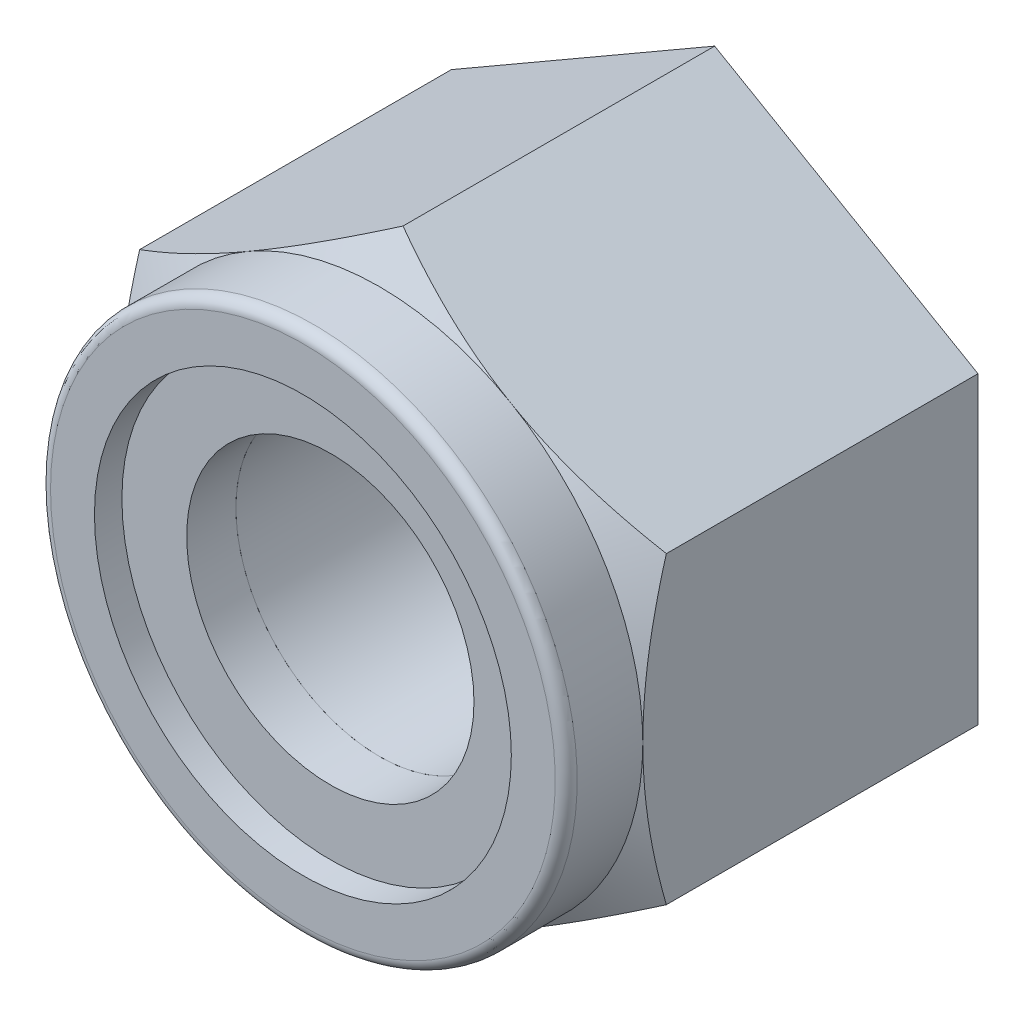
ISO-10303-21;
HEADER;
FILE_DESCRIPTION(('STEP AP214'),'2;1');
FILE_NAME('part.step','',(''),(''),'','','');
FILE_SCHEMA(('AUTOMOTIVE_DESIGN { 1 0 10303 214 1 1 1 1 }'));
ENDSEC;
DATA;
#1=APPLICATION_CONTEXT('core data for automotive mechanical design processes');
#2=APPLICATION_PROTOCOL_DEFINITION('international standard','automotive_design',2000,#1);
#3=PRODUCT_CONTEXT('',#1,'mechanical');
#4=PRODUCT('Part','Part','',(#3));
#5=PRODUCT_RELATED_PRODUCT_CATEGORY('part','',(#4));
#6=PRODUCT_DEFINITION_FORMATION('','',#4);
#7=PRODUCT_DEFINITION_CONTEXT('part definition',#1,'design');
#8=PRODUCT_DEFINITION('design','',#6,#7);
#9=PRODUCT_DEFINITION_SHAPE('','',#8);
#10=(LENGTH_UNIT() NAMED_UNIT(*) SI_UNIT(.MILLI.,.METRE.));
#11=(NAMED_UNIT(*) PLANE_ANGLE_UNIT() SI_UNIT($,.RADIAN.));
#12=(NAMED_UNIT(*) SI_UNIT($,.STERADIAN.) SOLID_ANGLE_UNIT());
#13=UNCERTAINTY_MEASURE_WITH_UNIT(LENGTH_MEASURE(1.E-05),#10,'distance_accuracy_value','');
#14=(GEOMETRIC_REPRESENTATION_CONTEXT(3) GLOBAL_UNCERTAINTY_ASSIGNED_CONTEXT((#13)) GLOBAL_UNIT_ASSIGNED_CONTEXT((#10,
#11,#12)) REPRESENTATION_CONTEXT('',''));
#15=CARTESIAN_POINT('',(0.,0.,0.));
#16=DIRECTION('',(0.,0.,1.));
#17=DIRECTION('',(1.,0.,0.));
#18=AXIS2_PLACEMENT_3D('',#15,#16,#17);
#19=CARTESIAN_POINT('',(0.,0.,10.9806921506248));
#20=DIRECTION('',(0.,0.,-1.));
#21=DIRECTION('',(-1.,0.,0.));
#22=AXIS2_PLACEMENT_3D('',#19,#20,#21);
#23=CYLINDRICAL_SURFACE('',#22,2.46333333333333);
#24=CARTESIAN_POINT('',(0.,0.,3.5));
#25=DIRECTION('',(0.,0.,1.));
#26=DIRECTION('',(1.,0.,0.));
#27=AXIS2_PLACEMENT_3D('',#24,#25,#26);
#28=CIRCLE('',#27,2.46333333333333);
#29=CARTESIAN_POINT('',(2.46333333333333,0.,3.5));
#30=VERTEX_POINT('',#29);
#31=EDGE_CURVE('E58',#30,#30,#28,.T.);
#32=ORIENTED_EDGE('',*,*,#31,.T.);
#33=EDGE_LOOP('',(#32));
#34=FACE_BOUND('',#33,.T.);
#35=CARTESIAN_POINT('',(0.,0.,4.01333333333333));
#36=DIRECTION('',(0.,0.,1.));
#37=DIRECTION('',(1.,0.,0.));
#38=AXIS2_PLACEMENT_3D('',#35,#36,#37);
#39=CIRCLE('',#38,2.46333333333333);
#40=CARTESIAN_POINT('',(2.46333333333333,0.,4.01333333333333));
#41=VERTEX_POINT('',#40);
#42=EDGE_CURVE('E11',#41,#41,#39,.T.);
#43=ORIENTED_EDGE('',*,*,#42,.F.);
#44=EDGE_LOOP('',(#43));
#45=FACE_BOUND('',#44,.T.);
#46=ADVANCED_FACE('F50',(#34,#45),#23,.T.);
#47=CARTESIAN_POINT('',(0.,0.,3.5));
#48=DIRECTION('',(0.,0.,1.));
#49=DIRECTION('',(1.,0.,0.));
#50=AXIS2_PLACEMENT_3D('',#47,#48,#49);
#51=PLANE('',#50);
#52=ORIENTED_EDGE('',*,*,#31,.F.);
#53=EDGE_LOOP('',(#52));
#54=FACE_BOUND('',#53,.T.);
#55=CARTESIAN_POINT('',(0.,0.,3.5));
#56=DIRECTION('',(0.,0.,1.));
#57=DIRECTION('',(1.,0.,0.));
#58=AXIS2_PLACEMENT_3D('',#55,#56,#57);
#59=CIRCLE('',#58,1.5);
#60=CARTESIAN_POINT('',(1.5,0.,3.5));
#61=VERTEX_POINT('',#60);
#62=EDGE_CURVE('E65',#61,#61,#59,.T.);
#63=ORIENTED_EDGE('',*,*,#62,.T.);
#64=EDGE_LOOP('',(#63));
#65=FACE_BOUND('',#64,.T.);
#66=ADVANCED_FACE('F82',(#54,#65),#51,.F.);
#67=CARTESIAN_POINT('',(0.,0.,10.9806921506248));
#68=DIRECTION('',(0.,0.,-1.));
#69=DIRECTION('',(-1.,0.,0.));
#70=AXIS2_PLACEMENT_3D('',#67,#68,#69);
#71=CYLINDRICAL_SURFACE('',#70,1.5);
#72=ORIENTED_EDGE('',*,*,#62,.F.);
#73=EDGE_LOOP('',(#72));
#74=FACE_BOUND('',#73,.T.);
#75=CARTESIAN_POINT('',(0.,0.,4.01333333333333));
#76=DIRECTION('',(0.,0.,1.));
#77=DIRECTION('',(1.,0.,0.));
#78=AXIS2_PLACEMENT_3D('',#75,#76,#77);
#79=CIRCLE('',#78,1.5);
#80=CARTESIAN_POINT('',(1.5,0.,4.01333333333333));
#81=VERTEX_POINT('',#80);
#82=EDGE_CURVE('E53',#81,#81,#79,.T.);
#83=ORIENTED_EDGE('',*,*,#82,.T.);
#84=EDGE_LOOP('',(#83));
#85=FACE_BOUND('',#84,.T.);
#86=ADVANCED_FACE('F74',(#74,#85),#71,.F.);
#87=CARTESIAN_POINT('',(2.17666666666667,0.,4.01333333333333));
#88=DIRECTION('',(0.,0.,1.));
#89=DIRECTION('',(1.,0.,0.));
#90=AXIS2_PLACEMENT_3D('',#87,#88,#89);
#91=PLANE('',#90);
#92=ORIENTED_EDGE('',*,*,#82,.F.);
#93=EDGE_LOOP('',(#92));
#94=FACE_BOUND('',#93,.T.);
#95=ORIENTED_EDGE('',*,*,#42,.T.);
#96=EDGE_LOOP('',(#95));
#97=FACE_BOUND('',#96,.T.);
#98=ADVANCED_FACE('F76',(#94,#97),#91,.T.);
#99=CLOSED_SHELL('',(#46,#66,#86,#98));
#100=MANIFOLD_SOLID_BREP('B2',#99);
#101=CARTESIAN_POINT('',(2.75,1.58771324027147,3.5));
#102=DIRECTION('',(-0.5,-0.866025403784439,0.));
#103=DIRECTION('',(0.866025403784439,-0.5,0.));
#104=AXIS2_PLACEMENT_3D('',#101,#102,#103);
#105=PLANE('',#104);
#106=CARTESIAN_POINT('',(2.7502,1.58759777021763,3.25431323663524));
#107=CARTESIAN_POINT('',(2.62935077934009,1.65737010029699,3.29461233775074));
#108=CARTESIAN_POINT('',(2.50745839737737,1.72774469983533,3.33126309740234));
#109=CARTESIAN_POINT('',(2.26156287327211,1.86971254687003,3.3952378170302));
#110=CARTESIAN_POINT('',(2.13755536142614,1.94130831721583,3.4225391443255));
#111=CARTESIAN_POINT('',(1.89107720202406,2.08361254889599,3.46503825470588));
#112=CARTESIAN_POINT('',(1.76864448141258,2.15429911309864,3.48051888137754));
#113=CARTESIAN_POINT('',(1.52320285763109,2.29600490065923,3.49900060263006));
#114=CARTESIAN_POINT('',(1.40019484676709,2.36702360884404,3.5020170005374));
#115=CARTESIAN_POINT('',(1.17034121338921,2.49972966594897,3.49574685457145));
#116=CARTESIAN_POINT('',(1.06346120874598,2.56143686540072,3.4879998457233));
#117=CARTESIAN_POINT('',(0.850397532665251,2.68444923614046,3.46344481893565));
#118=CARTESIAN_POINT('',(0.744214598351111,2.74575398185008,3.44662841034943));
#119=CARTESIAN_POINT('',(0.530711510606817,2.86902004703206,3.40458807765405));
#120=CARTESIAN_POINT('',(0.423418383857145,2.93096576264318,3.37918591931277));
#121=CARTESIAN_POINT('',(0.210432520715949,3.05393320806134,3.32153277416002));
#122=CARTESIAN_POINT('',(0.104737054973347,3.11495651365995,3.28929533670102));
#123=CARTESIAN_POINT('',(-0.000200000000000484,3.17554195059678,3.25431323663524));
#124=B_SPLINE_CURVE_WITH_KNOTS('',3,(#106,#107,#108,#109,#110,#111,#112,#113,#114,#115,#116,
#117,#118,#119,#120,#121,#122,#123),.UNSPECIFIED.,.F.,.F.,(4,2,2,2,2,2,2,2,4),(0.,
0.435912828725888,0.872873557116331,1.29901931904671,1.72464171213573,2.09526089052937,
2.46622354066374,2.84541551798557,3.22386274754524),.UNSPECIFIED.);
#125=CARTESIAN_POINT('',(2.75,1.58771324027147,3.25437990693814));
#126=VERTEX_POINT('',#125);
#127=CARTESIAN_POINT('',(1.375,2.38156986040721,3.5));
#128=VERTEX_POINT('',#127);
#129=EDGE_CURVE('E282',#126,#128,#124,.T.);
#130=ORIENTED_EDGE('',*,*,#129,.F.);
#131=DIRECTION('',(0.,0.,-1.));
#132=VECTOR('',#131,1.);
#133=CARTESIAN_POINT('',(2.75,1.58771324027147,3.5));
#134=LINE('',#133,#132);
#135=CARTESIAN_POINT('',(2.75,1.58771324027147,0.));
#136=VERTEX_POINT('',#135);
#137=EDGE_CURVE('E151',#126,#136,#134,.T.);
#138=ORIENTED_EDGE('',*,*,#137,.T.);
#139=DIRECTION('',(-0.866025403784439,0.5,0.));
#140=VECTOR('',#139,1.);
#141=CARTESIAN_POINT('',(2.75,1.58771324027147,0.));
#142=LINE('',#141,#140);
#143=CARTESIAN_POINT('',(0.,3.17542648054294,0.));
#144=VERTEX_POINT('',#143);
#145=EDGE_CURVE('E284',#136,#144,#142,.T.);
#146=ORIENTED_EDGE('',*,*,#145,.T.);
#147=DIRECTION('',(0.,0.,-1.));
#148=VECTOR('',#147,1.);
#149=CARTESIAN_POINT('',(0.,3.17542648054294,3.5));
#150=LINE('',#149,#148);
#151=CARTESIAN_POINT('',(0.,3.17542648054294,3.25437990693814));
#152=VERTEX_POINT('',#151);
#153=EDGE_CURVE('E229',#152,#144,#150,.T.);
#154=ORIENTED_EDGE('',*,*,#153,.F.);
#155=EDGE_CURVE('E275',#128,#152,#124,.T.);
#156=ORIENTED_EDGE('',*,*,#155,.F.);
#157=EDGE_LOOP('',(#130,#138,#146,#154,#156));
#158=FACE_BOUND('',#157,.T.);
#159=ADVANCED_FACE('F127',(#158),#105,.F.);
#160=CARTESIAN_POINT('',(0.,3.17542648054294,3.5));
#161=DIRECTION('',(0.5,-0.866025403784439,0.));
#162=DIRECTION('',(0.866025403784439,0.5,0.));
#163=AXIS2_PLACEMENT_3D('',#160,#161,#162);
#164=PLANE('',#163);
#165=CARTESIAN_POINT('',(0.000199999999999661,3.17554195059678,3.25431323663524));
#166=CARTESIAN_POINT('',(-0.120649220659906,3.10576962051743,3.29461233775074));
#167=CARTESIAN_POINT('',(-0.242541602622634,3.03539502097908,3.33126309740234));
#168=CARTESIAN_POINT('',(-0.488437126727893,2.89342717394439,3.3952378170302));
#169=CARTESIAN_POINT('',(-0.612444638573855,2.82183140359858,3.4225391443255));
#170=CARTESIAN_POINT('',(-0.858922797975943,2.67952717191842,3.46503825470588));
#171=CARTESIAN_POINT('',(-0.981355518587417,2.60884060771577,3.48051888137754));
#172=CARTESIAN_POINT('',(-1.22679714236891,2.46713482015519,3.49900060263006));
#173=CARTESIAN_POINT('',(-1.34980515323291,2.39611611197038,3.5020170005374));
#174=CARTESIAN_POINT('',(-1.57965878661079,2.26341005486544,3.49574685457145));
#175=CARTESIAN_POINT('',(-1.68653879125402,2.20170285541369,3.4879998457233));
#176=CARTESIAN_POINT('',(-1.89960246733475,2.07869048467395,3.46344481893565));
#177=CARTESIAN_POINT('',(-2.00578540164889,2.01738573896433,3.44662841034943));
#178=CARTESIAN_POINT('',(-2.21928848939318,1.89411967378235,3.40458807765405));
#179=CARTESIAN_POINT('',(-2.32658161614285,1.83217395817123,3.37918591931277));
#180=CARTESIAN_POINT('',(-2.53956747928405,1.70920651275308,3.32153277416002));
#181=CARTESIAN_POINT('',(-2.64526294502665,1.64818320715446,3.28929533670102));
#182=CARTESIAN_POINT('',(-2.7502,1.58759777021763,3.25431323663524));
#183=B_SPLINE_CURVE_WITH_KNOTS('',3,(#165,#166,#167,#168,#169,#170,#171,#172,#173,#174,#175,
#176,#177,#178,#179,#180,#181,#182),.UNSPECIFIED.,.F.,.F.,(4,2,2,2,2,2,2,2,4),(0.,
0.435912828725888,0.872873557116331,1.29901931904671,1.72464171213573,2.09526089052937,
2.46622354066374,2.84541551798557,3.22386274754524),.UNSPECIFIED.);
#184=CARTESIAN_POINT('',(-1.375,2.38156986040721,3.5));
#185=VERTEX_POINT('',#184);
#186=EDGE_CURVE('E283',#152,#185,#183,.T.);
#187=ORIENTED_EDGE('',*,*,#186,.F.);
#188=ORIENTED_EDGE('',*,*,#153,.T.);
#189=DIRECTION('',(-0.866025403784439,-0.5,0.));
#190=VECTOR('',#189,1.);
#191=CARTESIAN_POINT('',(0.,3.17542648054294,0.));
#192=LINE('',#191,#190);
#193=CARTESIAN_POINT('',(-2.75,1.58771324027147,0.));
#194=VERTEX_POINT('',#193);
#195=EDGE_CURVE('E286',#144,#194,#192,.T.);
#196=ORIENTED_EDGE('',*,*,#195,.T.);
#197=DIRECTION('',(0.,0.,-1.));
#198=VECTOR('',#197,1.);
#199=CARTESIAN_POINT('',(-2.75,1.58771324027147,3.5));
#200=LINE('',#199,#198);
#201=CARTESIAN_POINT('',(-2.75,1.58771324027147,3.25437990693814));
#202=VERTEX_POINT('',#201);
#203=EDGE_CURVE('E314',#202,#194,#200,.T.);
#204=ORIENTED_EDGE('',*,*,#203,.F.);
#205=EDGE_CURVE('E214',#185,#202,#183,.T.);
#206=ORIENTED_EDGE('',*,*,#205,.F.);
#207=EDGE_LOOP('',(#187,#188,#196,#204,#206));
#208=FACE_BOUND('',#207,.T.);
#209=ADVANCED_FACE('F267',(#208),#164,.F.);
#210=CARTESIAN_POINT('',(-2.75,1.58771324027147,3.5));
#211=DIRECTION('',(1.,0.,0.));
#212=DIRECTION('',(0.,0.,-1.));
#213=AXIS2_PLACEMENT_3D('',#210,#211,#212);
#214=PLANE('',#213);
#215=CARTESIAN_POINT('',(-2.75,-4.26510950574755,2.15777245042504));
#216=CARTESIAN_POINT('',(-2.75,-4.14499875858726,2.21603820896004));
#217=CARTESIAN_POINT('',(-2.75,-4.02461232765612,2.27374539492879));
#218=CARTESIAN_POINT('',(-2.75,-3.78314149943342,2.38772848645914));
#219=CARTESIAN_POINT('',(-2.75,-3.66205699582414,2.44400416653624));
#220=CARTESIAN_POINT('',(-2.75,-3.41841969124184,2.55509317360131));
#221=CARTESIAN_POINT('',(-2.75,-3.2958624856058,2.60989687376236));
#222=CARTESIAN_POINT('',(-2.75,-3.04977343717901,2.71726203769209));
#223=CARTESIAN_POINT('',(-2.75,-2.92624164074826,2.76982360736297));
#224=CARTESIAN_POINT('',(-2.75,-2.67401306448425,2.87375833949831));
#225=CARTESIAN_POINT('',(-2.75,-2.54527793276523,2.92503893776019));
#226=CARTESIAN_POINT('',(-2.75,-2.28630162404454,3.02371978466043));
#227=CARTESIAN_POINT('',(-2.75,-2.1560602798887,3.07111959781411));
#228=CARTESIAN_POINT('',(-2.75,-1.89410807478132,3.16079475709495));
#229=CARTESIAN_POINT('',(-2.75,-1.76240080051129,3.20308047514479));
#230=CARTESIAN_POINT('',(-2.75,-1.49709689690729,3.2811707077853));
#231=CARTESIAN_POINT('',(-2.75,-1.3635008769386,3.31697726352185));
#232=CARTESIAN_POINT('',(-2.75,-1.09508836424644,3.38019963945417));
#233=CARTESIAN_POINT('',(-2.75,-0.960282833114952,3.407661140468));
#234=CARTESIAN_POINT('',(-2.75,-0.688994832454245,3.45264257692727));
#235=CARTESIAN_POINT('',(-2.75,-0.552512522432072,3.47016345062789));
#236=CARTESIAN_POINT('',(-2.75,-0.280335449854621,3.49363664926511));
#237=CARTESIAN_POINT('',(-2.75,-0.144653835955006,3.4997376898024));
#238=CARTESIAN_POINT('',(-2.75,0.126742487000314,3.50024547172404));
#239=CARTESIAN_POINT('',(-2.75,0.262457196612999,3.4946520004404));
#240=CARTESIAN_POINT('',(-2.75,0.492852724450967,3.47562460242377));
#241=CARTESIAN_POINT('',(-2.75,0.587780188881238,3.4650039678801));
#242=CARTESIAN_POINT('',(-2.75,0.776938147082502,3.43870246873907));
#243=CARTESIAN_POINT('',(-2.75,0.871168544311427,3.42302091615891));
#244=CARTESIAN_POINT('',(-2.75,1.15267765808897,3.36920689766723));
#245=CARTESIAN_POINT('',(-2.75,1.33866809643856,3.32431499935835));
#246=CARTESIAN_POINT('',(-2.75,1.71088847956003,3.22023568396465));
#247=CARTESIAN_POINT('',(-2.75,1.89703305126467,3.16075452924488));
#248=CARTESIAN_POINT('',(-2.75,2.17366611941341,3.0643520438026));
#249=CARTESIAN_POINT('',(-2.75,2.26543713771322,3.03102491391658));
#250=CARTESIAN_POINT('',(-2.75,2.44822137511287,2.96235356054217));
#251=CARTESIAN_POINT('',(-2.75,2.53923460259993,2.9270093594128));
#252=CARTESIAN_POINT('',(-2.75,2.75196797375468,2.84212214855651));
#253=CARTESIAN_POINT('',(-2.75,2.87341553440109,2.7918980740795));
#254=CARTESIAN_POINT('',(-2.75,3.11528951560144,2.68904269880338));
#255=CARTESIAN_POINT('',(-2.75,3.23571587943298,2.63641126531227));
#256=CARTESIAN_POINT('',(-2.75,3.59576413448948,2.47564414382368));
#257=CARTESIAN_POINT('',(-2.75,3.8341098185328,2.36465419221918));
#258=CARTESIAN_POINT('',(-2.75,4.30864079836104,2.13760774363572));
#259=CARTESIAN_POINT('',(-2.75,4.54482370809503,2.02154631441393));
#260=CARTESIAN_POINT('',(-2.75,5.01548505243664,1.7860049685896));
#261=CARTESIAN_POINT('',(-2.75,5.24996342514981,1.66652492862177));
#262=CARTESIAN_POINT('',(-2.75,5.69834862633678,1.43511295846941));
#263=CARTESIAN_POINT('',(-2.75,5.91235477549199,1.32337280463302));
#264=CARTESIAN_POINT('',(-2.75,6.33956547575851,1.09835456208858));
#265=CARTESIAN_POINT('',(-2.75,6.5527699991992,0.985076420903254));
#266=CARTESIAN_POINT('',(-2.75,6.97803074930057,0.757624740026024));
#267=CARTESIAN_POINT('',(-2.75,7.1900885086308,0.643454061672293));
#268=CARTESIAN_POINT('',(-2.75,7.61369009310109,0.414190143302314));
#269=CARTESIAN_POINT('',(-2.75,7.82523394547512,0.299096953627499));
#270=CARTESIAN_POINT('',(-2.75,8.03658809289811,0.183658857249517));
#271=B_SPLINE_CURVE_WITH_KNOTS('',3,(#215,#216,#217,#218,#219,#220,#221,#222,#223,#224,#225,
#226,#227,#228,#229,#230,#231,#232,#233,#234,#235,#236,#237,#238,#239,#240,#241,#242,#243,#244,
#245,#246,#247,#248,#249,#250,#251,#252,#253,#254,#255,#256,#257,#258,#259,#260,#261,#262,#263,
#264,#265,#266,#267,#268,#269,#270),.UNSPECIFIED.,.F.,.F.,(4,2,2,2,2,2,2,2,2,2,2,2,2,2,2,2,2,2,
2,2,2,2,2,2,2,2,2,4),(0.,0.400496354926703,0.80105540846209,1.2037947052646,1.60651495843558,
2.02218514394157,2.43790191038234,2.8527608946239,3.26748895644833,3.67990411232275,
4.09228033553819,4.49924795762455,4.90622298059591,5.19264436826328,5.47910470855723,
6.05234388839899,6.63823919147077,6.93112616857336,7.2240098996844,7.61824443594005,
8.01250072838161,8.80116029266611,9.59060472181353,10.3800776751702,11.1043358509028,
11.8286188012761,12.5511334245615,13.2736088850821),.UNSPECIFIED.);
#272=CARTESIAN_POINT('',(-2.75,0.,3.5));
#273=VERTEX_POINT('',#272);
#274=EDGE_CURVE('E212',#202,#273,#271,.F.);
#275=ORIENTED_EDGE('',*,*,#274,.F.);
#276=ORIENTED_EDGE('',*,*,#203,.T.);
#277=DIRECTION('',(0.,-1.,0.));
#278=VECTOR('',#277,1.);
#279=CARTESIAN_POINT('',(-2.75,1.58771324027147,0.));
#280=LINE('',#279,#278);
#281=CARTESIAN_POINT('',(-2.75,-1.58771324027147,0.));
#282=VERTEX_POINT('',#281);
#283=EDGE_CURVE('E290',#194,#282,#280,.T.);
#284=ORIENTED_EDGE('',*,*,#283,.T.);
#285=DIRECTION('',(0.,0.,-1.));
#286=VECTOR('',#285,1.);
#287=CARTESIAN_POINT('',(-2.75,-1.58771324027147,3.5));
#288=LINE('',#287,#286);
#289=CARTESIAN_POINT('',(-2.75,-1.58771324027147,3.25437990693814));
#290=VERTEX_POINT('',#289);
#291=EDGE_CURVE('E234',#290,#282,#288,.T.);
#292=ORIENTED_EDGE('',*,*,#291,.F.);
#293=EDGE_CURVE('E219',#273,#290,#271,.F.);
#294=ORIENTED_EDGE('',*,*,#293,.F.);
#295=EDGE_LOOP('',(#275,#276,#284,#292,#294));
#296=FACE_BOUND('',#295,.T.);
#297=ADVANCED_FACE('F232',(#296),#214,.F.);
#298=CARTESIAN_POINT('',(-2.75,-1.58771324027147,3.5));
#299=DIRECTION('',(0.5,0.866025403784438,0.));
#300=DIRECTION('',(-0.866025403784439,0.5,0.));
#301=AXIS2_PLACEMENT_3D('',#298,#299,#300);
#302=PLANE('',#301);
#303=CARTESIAN_POINT('',(-2.7502,-1.58759777021763,3.25431323663524));
#304=CARTESIAN_POINT('',(-2.62935077934009,-1.65737010029699,3.29461233775074));
#305=CARTESIAN_POINT('',(-2.50745839737737,-1.72774469983533,3.33126309740234));
#306=CARTESIAN_POINT('',(-2.26156287327211,-1.86971254687003,3.3952378170302));
#307=CARTESIAN_POINT('',(-2.13755536142614,-1.94130831721583,3.4225391443255));
#308=CARTESIAN_POINT('',(-1.89107720202406,-2.08361254889599,3.46503825470588));
#309=CARTESIAN_POINT('',(-1.76864448141258,-2.15429911309864,3.48051888137754));
#310=CARTESIAN_POINT('',(-1.52320285763109,-2.29600490065923,3.49900060263006));
#311=CARTESIAN_POINT('',(-1.40019484676709,-2.36702360884404,3.5020170005374));
#312=CARTESIAN_POINT('',(-1.17034121338921,-2.49972966594897,3.49574685457145));
#313=CARTESIAN_POINT('',(-1.06346120874598,-2.56143686540073,3.4879998457233));
#314=CARTESIAN_POINT('',(-0.850397532665252,-2.68444923614047,3.46344481893565));
#315=CARTESIAN_POINT('',(-0.744214598351112,-2.74575398185008,3.44662841034943));
#316=CARTESIAN_POINT('',(-0.530711510606817,-2.86902004703206,3.40458807765405));
#317=CARTESIAN_POINT('',(-0.423418383857146,-2.93096576264318,3.37918591931277));
#318=CARTESIAN_POINT('',(-0.21043252071595,-3.05393320806134,3.32153277416002));
#319=CARTESIAN_POINT('',(-0.104737054973348,-3.11495651365995,3.28929533670102));
#320=CARTESIAN_POINT('',(0.000199999999999663,-3.17554195059678,3.25431323663524));
#321=B_SPLINE_CURVE_WITH_KNOTS('',3,(#303,#304,#305,#306,#307,#308,#309,#310,#311,#312,#313,
#314,#315,#316,#317,#318,#319,#320),.UNSPECIFIED.,.F.,.F.,(4,2,2,2,2,2,2,2,4),(0.,
0.435912828725888,0.872873557116331,1.29901931904671,1.72464171213573,2.09526089052937,
2.46622354066374,2.84541551798557,3.22386274754524),.UNSPECIFIED.);
#322=CARTESIAN_POINT('',(-1.375,-2.3815698604072,3.5));
#323=VERTEX_POINT('',#322);
#324=EDGE_CURVE('E225',#290,#323,#321,.T.);
#325=ORIENTED_EDGE('',*,*,#324,.F.);
#326=ORIENTED_EDGE('',*,*,#291,.T.);
#327=DIRECTION('',(0.866025403784438,-0.5,0.));
#328=VECTOR('',#327,1.);
#329=CARTESIAN_POINT('',(-2.75,-1.58771324027147,0.));
#330=LINE('',#329,#328);
#331=CARTESIAN_POINT('',(0.,-3.17542648054294,0.));
#332=VERTEX_POINT('',#331);
#333=EDGE_CURVE('E293',#282,#332,#330,.T.);
#334=ORIENTED_EDGE('',*,*,#333,.T.);
#335=DIRECTION('',(0.,0.,-1.));
#336=VECTOR('',#335,1.);
#337=CARTESIAN_POINT('',(0.,-3.17542648054294,3.5));
#338=LINE('',#337,#336);
#339=CARTESIAN_POINT('',(0.,-3.17542648054294,3.25437990693814));
#340=VERTEX_POINT('',#339);
#341=EDGE_CURVE('E309',#340,#332,#338,.T.);
#342=ORIENTED_EDGE('',*,*,#341,.F.);
#343=EDGE_CURVE('E239',#323,#340,#321,.T.);
#344=ORIENTED_EDGE('',*,*,#343,.F.);
#345=EDGE_LOOP('',(#325,#326,#334,#342,#344));
#346=FACE_BOUND('',#345,.T.);
#347=ADVANCED_FACE('F266',(#346),#302,.F.);
#348=CARTESIAN_POINT('',(0.,-3.17542648054294,3.5));
#349=DIRECTION('',(-0.5,0.866025403784439,0.));
#350=DIRECTION('',(-0.866025403784439,-0.5,0.));
#351=AXIS2_PLACEMENT_3D('',#348,#349,#350);
#352=PLANE('',#351);
#353=CARTESIAN_POINT('',(-0.000200000000000319,-3.17554195059678,3.25431323663524));
#354=CARTESIAN_POINT('',(0.120649220659906,-3.10576962051743,3.29461233775074));
#355=CARTESIAN_POINT('',(0.242541602622633,-3.03539502097908,3.33126309740234));
#356=CARTESIAN_POINT('',(0.488437126727892,-2.89342717394439,3.3952378170302));
#357=CARTESIAN_POINT('',(0.612444638573855,-2.82183140359858,3.4225391443255));
#358=CARTESIAN_POINT('',(0.858922797975943,-2.67952717191843,3.46503825470588));
#359=CARTESIAN_POINT('',(0.981355518587417,-2.60884060771577,3.48051888137754));
#360=CARTESIAN_POINT('',(1.22679714236891,-2.46713482015519,3.49900060263006));
#361=CARTESIAN_POINT('',(1.34980515323291,-2.39611611197038,3.5020170005374));
#362=CARTESIAN_POINT('',(1.57965878661079,-2.26341005486544,3.49574685457145));
#363=CARTESIAN_POINT('',(1.68653879125402,-2.20170285541369,3.4879998457233));
#364=CARTESIAN_POINT('',(1.89960246733475,-2.07869048467395,3.46344481893565));
#365=CARTESIAN_POINT('',(2.00578540164889,-2.01738573896434,3.44662841034943));
#366=CARTESIAN_POINT('',(2.21928848939318,-1.89411967378235,3.40458807765404));
#367=CARTESIAN_POINT('',(2.32658161614285,-1.83217395817123,3.37918591931277));
#368=CARTESIAN_POINT('',(2.53956747928405,-1.70920651275308,3.32153277416002));
#369=CARTESIAN_POINT('',(2.64526294502665,-1.64818320715446,3.28929533670102));
#370=CARTESIAN_POINT('',(2.7502,-1.58759777021763,3.25431323663524));
#371=B_SPLINE_CURVE_WITH_KNOTS('',3,(#353,#354,#355,#356,#357,#358,#359,#360,#361,#362,#363,
#364,#365,#366,#367,#368,#369,#370),.UNSPECIFIED.,.F.,.F.,(4,2,2,2,2,2,2,2,4),(0.,
0.435912828725888,0.872873557116331,1.29901931904671,1.72464171213573,2.09526089052937,
2.46622354066374,2.84541551798557,3.22386274754524),.UNSPECIFIED.);
#372=CARTESIAN_POINT('',(1.375,-2.38156986040721,3.5));
#373=VERTEX_POINT('',#372);
#374=EDGE_CURVE('E394',#340,#373,#371,.T.);
#375=ORIENTED_EDGE('',*,*,#374,.F.);
#376=ORIENTED_EDGE('',*,*,#341,.T.);
#377=DIRECTION('',(0.866025403784439,0.5,0.));
#378=VECTOR('',#377,1.);
#379=CARTESIAN_POINT('',(0.,-3.17542648054294,0.));
#380=LINE('',#379,#378);
#381=CARTESIAN_POINT('',(2.75,-1.58771324027147,0.));
#382=VERTEX_POINT('',#381);
#383=EDGE_CURVE('E297',#332,#382,#380,.T.);
#384=ORIENTED_EDGE('',*,*,#383,.T.);
#385=DIRECTION('',(0.,0.,-1.));
#386=VECTOR('',#385,1.);
#387=CARTESIAN_POINT('',(2.75,-1.58771324027147,3.5));
#388=LINE('',#387,#386);
#389=CARTESIAN_POINT('',(2.75,-1.5877132402719,3.25437990693843));
#390=VERTEX_POINT('',#389);
#391=EDGE_CURVE('E306',#390,#382,#388,.T.);
#392=ORIENTED_EDGE('',*,*,#391,.F.);
#393=EDGE_CURVE('E372',#373,#390,#371,.T.);
#394=ORIENTED_EDGE('',*,*,#393,.F.);
#395=EDGE_LOOP('',(#375,#376,#384,#392,#394));
#396=FACE_BOUND('',#395,.T.);
#397=ADVANCED_FACE('F382',(#396),#352,.F.);
#398=CARTESIAN_POINT('',(2.75,-1.58771324027147,3.5));
#399=DIRECTION('',(-1.,0.,0.));
#400=DIRECTION('',(0.,-1.,0.));
#401=AXIS2_PLACEMENT_3D('',#398,#399,#400);
#402=PLANE('',#401);
#403=CARTESIAN_POINT('',(2.75,-4.26510950574755,2.15777245042504));
#404=CARTESIAN_POINT('',(2.75,-4.14499875858726,2.21603820896004));
#405=CARTESIAN_POINT('',(2.75,-4.02461232765613,2.27374539492879));
#406=CARTESIAN_POINT('',(2.75,-3.78314149943342,2.38772848645914));
#407=CARTESIAN_POINT('',(2.75,-3.66205699582414,2.44400416653624));
#408=CARTESIAN_POINT('',(2.75,-3.41841969124184,2.55509317360131));
#409=CARTESIAN_POINT('',(2.75,-3.2958624856058,2.60989687376236));
#410=CARTESIAN_POINT('',(2.75,-3.04977343717901,2.71726203769209));
#411=CARTESIAN_POINT('',(2.75,-2.92624164074826,2.76982360736297));
#412=CARTESIAN_POINT('',(2.75,-2.67401306448425,2.87375833949831));
#413=CARTESIAN_POINT('',(2.75,-2.54527793276523,2.92503893776019));
#414=CARTESIAN_POINT('',(2.75,-2.28630162404454,3.02371978466043));
#415=CARTESIAN_POINT('',(2.75,-2.1560602798887,3.07111959781411));
#416=CARTESIAN_POINT('',(2.75,-1.89410807478132,3.16079475709495));
#417=CARTESIAN_POINT('',(2.75,-1.76240080051129,3.20308047514479));
#418=CARTESIAN_POINT('',(2.75,-1.49709689690729,3.2811707077853));
#419=CARTESIAN_POINT('',(2.75,-1.3635008769386,3.31697726352185));
#420=CARTESIAN_POINT('',(2.75,-1.09508836424644,3.38019963945417));
#421=CARTESIAN_POINT('',(2.75,-0.960282833114954,3.407661140468));
#422=CARTESIAN_POINT('',(2.75,-0.688994832454247,3.45264257692727));
#423=CARTESIAN_POINT('',(2.75,-0.552512522432073,3.47016345062789));
#424=CARTESIAN_POINT('',(2.75,-0.280335449854623,3.49363664926511));
#425=CARTESIAN_POINT('',(2.75,-0.144653835955008,3.4997376898024));
#426=CARTESIAN_POINT('',(2.75,0.126742487000313,3.50024547172404));
#427=CARTESIAN_POINT('',(2.75,0.262457196612998,3.4946520004404));
#428=CARTESIAN_POINT('',(2.75,0.492852724450965,3.47562460242377));
#429=CARTESIAN_POINT('',(2.75,0.587780188881237,3.4650039678801));
#430=CARTESIAN_POINT('',(2.75,0.7769381470825,3.43870246873907));
#431=CARTESIAN_POINT('',(2.75,0.871168544311425,3.42302091615891));
#432=CARTESIAN_POINT('',(2.75,1.15267765808897,3.36920689766723));
#433=CARTESIAN_POINT('',(2.75,1.33866809643856,3.32431499935835));
#434=CARTESIAN_POINT('',(2.75,1.71088847956002,3.22023568396465));
#435=CARTESIAN_POINT('',(2.75,1.89703305126467,3.16075452924488));
#436=CARTESIAN_POINT('',(2.75,2.17366611941341,3.0643520438026));
#437=CARTESIAN_POINT('',(2.75,2.26543713771322,3.03102491391658));
#438=CARTESIAN_POINT('',(2.75,2.44822137511287,2.96235356054217));
#439=CARTESIAN_POINT('',(2.75,2.53923460259993,2.9270093594128));
#440=CARTESIAN_POINT('',(2.75,2.75196797375468,2.84212214855651));
#441=CARTESIAN_POINT('',(2.75,2.87341553440109,2.7918980740795));
#442=CARTESIAN_POINT('',(2.75,3.11528951560144,2.68904269880338));
#443=CARTESIAN_POINT('',(2.75,3.23571587943297,2.63641126531227));
#444=CARTESIAN_POINT('',(2.75,3.59576413448948,2.47564414382368));
#445=CARTESIAN_POINT('',(2.75,3.8341098185328,2.36465419221918));
#446=CARTESIAN_POINT('',(2.75,4.30864079836104,2.13760774363572));
#447=CARTESIAN_POINT('',(2.75,4.54482370809503,2.02154631441393));
#448=CARTESIAN_POINT('',(2.75,5.01548505243664,1.7860049685896));
#449=CARTESIAN_POINT('',(2.75,5.24996342514981,1.66652492862177));
#450=CARTESIAN_POINT('',(2.75,5.69834862633678,1.43511295846941));
#451=CARTESIAN_POINT('',(2.75,5.91235477549199,1.32337280463302));
#452=CARTESIAN_POINT('',(2.75,6.33956547575851,1.09835456208858));
#453=CARTESIAN_POINT('',(2.75,6.5527699991992,0.985076420903252));
#454=CARTESIAN_POINT('',(2.75,6.97803074930057,0.757624740026023));
#455=CARTESIAN_POINT('',(2.75,7.1900885086308,0.643454061672292));
#456=CARTESIAN_POINT('',(2.75,7.61369009310109,0.414190143302314));
#457=CARTESIAN_POINT('',(2.75,7.82523394547512,0.2990969536275));
#458=CARTESIAN_POINT('',(2.75,8.03658809289811,0.183658857249518));
#459=B_SPLINE_CURVE_WITH_KNOTS('',3,(#403,#404,#405,#406,#407,#408,#409,#410,#411,#412,#413,
#414,#415,#416,#417,#418,#419,#420,#421,#422,#423,#424,#425,#426,#427,#428,#429,#430,#431,#432,
#433,#434,#435,#436,#437,#438,#439,#440,#441,#442,#443,#444,#445,#446,#447,#448,#449,#450,#451,
#452,#453,#454,#455,#456,#457,#458),.UNSPECIFIED.,.F.,.F.,(4,2,2,2,2,2,2,2,2,2,2,2,2,2,2,2,2,2,
2,2,2,2,2,2,2,2,2,4),(0.,0.400496354926705,0.801055408462091,1.2037947052646,1.60651495843558,
2.02218514394157,2.43790191038234,2.8527608946239,3.26748895644833,3.67990411232275,
4.09228033553819,4.49924795762455,4.90622298059591,5.19264436826329,5.47910470855723,
6.05234388839899,6.63823919147077,6.93112616857337,7.2240098996844,7.61824443594005,
8.01250072838161,8.80116029266611,9.59060472181354,10.3800776751702,11.1043358509028,
11.8286188012761,12.5511334245615,13.2736088850821),.UNSPECIFIED.);
#460=CARTESIAN_POINT('',(2.75,0.,3.5));
#461=VERTEX_POINT('',#460);
#462=EDGE_CURVE('E371',#390,#461,#459,.T.);
#463=ORIENTED_EDGE('',*,*,#462,.F.);
#464=ORIENTED_EDGE('',*,*,#391,.T.);
#465=DIRECTION('',(0.,1.,0.));
#466=VECTOR('',#465,1.);
#467=CARTESIAN_POINT('',(2.75,-1.58771324027147,0.));
#468=LINE('',#467,#466);
#469=EDGE_CURVE('E301',#382,#136,#468,.T.);
#470=ORIENTED_EDGE('',*,*,#469,.T.);
#471=ORIENTED_EDGE('',*,*,#137,.F.);
#472=EDGE_CURVE('E208',#461,#126,#459,.T.);
#473=ORIENTED_EDGE('',*,*,#472,.F.);
#474=EDGE_LOOP('',(#463,#464,#470,#471,#473));
#475=FACE_BOUND('',#474,.T.);
#476=ADVANCED_FACE('F377',(#475),#402,.F.);
#477=CARTESIAN_POINT('',(2.75,1.58771324027147,0.));
#478=DIRECTION('',(0.,0.,-1.));
#479=DIRECTION('',(-1.,0.,0.));
#480=AXIS2_PLACEMENT_3D('',#477,#478,#479);
#481=PLANE('',#480);
#482=CARTESIAN_POINT('',(0.,0.,0.));
#483=DIRECTION('',(0.,0.,-1.));
#484=DIRECTION('',(-1.,0.,0.));
#485=AXIS2_PLACEMENT_3D('',#482,#483,#484);
#486=CIRCLE('',#485,1.5);
#487=CARTESIAN_POINT('',(-1.5,0.,0.));
#488=VERTEX_POINT('',#487);
#489=EDGE_CURVE('E327',#488,#488,#486,.T.);
#490=ORIENTED_EDGE('',*,*,#489,.F.);
#491=EDGE_LOOP('',(#490));
#492=FACE_BOUND('',#491,.T.);
#493=ORIENTED_EDGE('',*,*,#145,.F.);
#494=ORIENTED_EDGE('',*,*,#469,.F.);
#495=ORIENTED_EDGE('',*,*,#383,.F.);
#496=ORIENTED_EDGE('',*,*,#333,.F.);
#497=ORIENTED_EDGE('',*,*,#283,.F.);
#498=ORIENTED_EDGE('',*,*,#195,.F.);
#499=EDGE_LOOP('',(#493,#494,#495,#496,#497,#498));
#500=FACE_BOUND('',#499,.T.);
#501=ADVANCED_FACE('F381',(#492,#500),#481,.T.);
#502=CARTESIAN_POINT('',(0.,0.,2.86491470389142));
#503=DIRECTION('',(0.,0.,-1.));
#504=DIRECTION('',(-1.,0.,0.));
#505=AXIS2_PLACEMENT_3D('',#502,#503,#504);
#506=CONICAL_SURFACE('',#505,3.85,1.0471975511966);
#507=ORIENTED_EDGE('',*,*,#293,.T.);
#508=ORIENTED_EDGE('',*,*,#324,.T.);
#509=CARTESIAN_POINT('',(0.,0.,3.5));
#510=DIRECTION('',(0.,0.,-1.));
#511=DIRECTION('',(-1.,0.,0.));
#512=AXIS2_PLACEMENT_3D('',#509,#510,#511);
#513=CIRCLE('',#512,2.75);
#514=EDGE_CURVE('E203',#323,#273,#513,.T.);
#515=ORIENTED_EDGE('',*,*,#514,.T.);
#516=EDGE_LOOP('',(#507,#508,#515));
#517=FACE_BOUND('',#516,.T.);
#518=ADVANCED_FACE('F223',(#517),#506,.T.);
#519=ORIENTED_EDGE('',*,*,#343,.T.);
#520=ORIENTED_EDGE('',*,*,#374,.T.);
#521=EDGE_CURVE('E228',#373,#323,#513,.T.);
#522=ORIENTED_EDGE('',*,*,#521,.T.);
#523=EDGE_LOOP('',(#519,#520,#522));
#524=FACE_BOUND('',#523,.T.);
#525=ADVANCED_FACE('F419',(#524),#506,.T.);
#526=ORIENTED_EDGE('',*,*,#393,.T.);
#527=ORIENTED_EDGE('',*,*,#462,.T.);
#528=EDGE_CURVE('E414',#461,#373,#513,.T.);
#529=ORIENTED_EDGE('',*,*,#528,.T.);
#530=EDGE_LOOP('',(#526,#527,#529));
#531=FACE_BOUND('',#530,.T.);
#532=ADVANCED_FACE('F413',(#531),#506,.T.);
#533=ORIENTED_EDGE('',*,*,#129,.T.);
#534=EDGE_CURVE('E416',#128,#461,#513,.T.);
#535=ORIENTED_EDGE('',*,*,#534,.T.);
#536=ORIENTED_EDGE('',*,*,#472,.T.);
#537=EDGE_LOOP('',(#533,#535,#536));
#538=FACE_BOUND('',#537,.T.);
#539=ADVANCED_FACE('F260',(#538),#506,.T.);
#540=ORIENTED_EDGE('',*,*,#155,.T.);
#541=ORIENTED_EDGE('',*,*,#186,.T.);
#542=EDGE_CURVE('E143',#185,#128,#513,.T.);
#543=ORIENTED_EDGE('',*,*,#542,.T.);
#544=EDGE_LOOP('',(#540,#541,#543));
#545=FACE_BOUND('',#544,.T.);
#546=ADVANCED_FACE('F431',(#545),#506,.T.);
#547=ORIENTED_EDGE('',*,*,#205,.T.);
#548=ORIENTED_EDGE('',*,*,#274,.T.);
#549=CARTESIAN_POINT('',(0.,0.,3.5));
#550=DIRECTION('',(0.,0.,-1.));
#551=DIRECTION('',(-1.,0.,0.));
#552=AXIS2_PLACEMENT_3D('',#549,#550,#551);
#553=CIRCLE('',#552,2.75);
#554=EDGE_CURVE('E199',#273,#185,#553,.T.);
#555=ORIENTED_EDGE('',*,*,#554,.T.);
#556=EDGE_LOOP('',(#547,#548,#555));
#557=FACE_BOUND('',#556,.T.);
#558=ADVANCED_FACE('F213',(#557),#506,.T.);
#559=CARTESIAN_POINT('',(0.,0.,0.));
#560=DIRECTION('',(0.,0.,-1.));
#561=DIRECTION('',(-1.,0.,0.));
#562=AXIS2_PLACEMENT_3D('',#559,#560,#561);
#563=CYLINDRICAL_SURFACE('',#562,2.46333333333333);
#564=CARTESIAN_POINT('',(0.,0.,4.01333333333333));
#565=DIRECTION('',(0.,0.,-1.));
#566=DIRECTION('',(-1.,0.,0.));
#567=AXIS2_PLACEMENT_3D('',#564,#565,#566);
#568=CIRCLE('',#567,2.46333333333333);
#569=CARTESIAN_POINT('',(-2.46333333333333,0.,4.01333333333333));
#570=VERTEX_POINT('',#569);
#571=EDGE_CURVE('E209',#570,#570,#568,.T.);
#572=ORIENTED_EDGE('',*,*,#571,.F.);
#573=EDGE_LOOP('',(#572));
#574=FACE_BOUND('',#573,.T.);
#575=CARTESIAN_POINT('',(0.,0.,3.5));
#576=DIRECTION('',(0.,0.,-1.));
#577=DIRECTION('',(-1.,0.,0.));
#578=AXIS2_PLACEMENT_3D('',#575,#576,#577);
#579=CIRCLE('',#578,2.46333333333333);
#580=CARTESIAN_POINT('',(-2.46333333333333,0.,3.5));
#581=VERTEX_POINT('',#580);
#582=EDGE_CURVE('E319',#581,#581,#579,.T.);
#583=ORIENTED_EDGE('',*,*,#582,.T.);
#584=EDGE_LOOP('',(#583));
#585=FACE_BOUND('',#584,.T.);
#586=ADVANCED_FACE('F430',(#574,#585),#563,.F.);
#587=CARTESIAN_POINT('',(2.17666666666667,0.,4.01333333333333));
#588=DIRECTION('',(0.,0.,1.));
#589=DIRECTION('',(1.,0.,0.));
#590=AXIS2_PLACEMENT_3D('',#587,#588,#589);
#591=PLANE('',#590);
#592=CARTESIAN_POINT('',(0.,0.,4.01333333333333));
#593=DIRECTION('',(0.,0.,-1.));
#594=DIRECTION('',(-1.,0.,0.));
#595=AXIS2_PLACEMENT_3D('',#592,#593,#594);
#596=CIRCLE('',#595,2.17666666666667);
#597=CARTESIAN_POINT('',(-2.17666666666667,0.,4.01333333333333));
#598=VERTEX_POINT('',#597);
#599=EDGE_CURVE('E354',#598,#598,#596,.T.);
#600=ORIENTED_EDGE('',*,*,#599,.F.);
#601=EDGE_LOOP('',(#600));
#602=FACE_BOUND('',#601,.T.);
#603=ORIENTED_EDGE('',*,*,#571,.T.);
#604=EDGE_LOOP('',(#603));
#605=FACE_BOUND('',#604,.T.);
#606=ADVANCED_FACE('F436',(#602,#605),#591,.F.);
#607=CARTESIAN_POINT('',(0.,0.,0.));
#608=DIRECTION('',(0.,0.,-1.));
#609=DIRECTION('',(-1.,0.,0.));
#610=AXIS2_PLACEMENT_3D('',#607,#608,#609);
#611=CYLINDRICAL_SURFACE('',#610,2.17666666666667);
#612=CARTESIAN_POINT('',(0.,0.,4.3));
#613=DIRECTION('',(0.,0.,-1.));
#614=DIRECTION('',(-1.,0.,0.));
#615=AXIS2_PLACEMENT_3D('',#612,#613,#614);
#616=CIRCLE('',#615,2.17666666666667);
#617=CARTESIAN_POINT('',(-2.17666666666667,0.,4.3));
#618=VERTEX_POINT('',#617);
#619=EDGE_CURVE('E326',#618,#618,#616,.T.);
#620=ORIENTED_EDGE('',*,*,#619,.F.);
#621=EDGE_LOOP('',(#620));
#622=FACE_BOUND('',#621,.T.);
#623=ORIENTED_EDGE('',*,*,#599,.T.);
#624=EDGE_LOOP('',(#623));
#625=FACE_BOUND('',#624,.T.);
#626=ADVANCED_FACE('F348',(#622,#625),#611,.F.);
#627=CARTESIAN_POINT('',(2.75,0.,4.3));
#628=DIRECTION('',(0.,0.,-1.));
#629=DIRECTION('',(-1.,0.,0.));
#630=AXIS2_PLACEMENT_3D('',#627,#628,#629);
#631=PLANE('',#630);
#632=CARTESIAN_POINT('',(0.,0.,4.3));
#633=DIRECTION('',(0.,0.,-1.));
#634=DIRECTION('',(-1.,0.,0.));
#635=AXIS2_PLACEMENT_3D('',#632,#633,#634);
#636=CIRCLE('',#635,2.63533333333333);
#637=CARTESIAN_POINT('',(-2.63533333333333,0.,4.3));
#638=VERTEX_POINT('',#637);
#639=EDGE_CURVE('E48',#638,#638,#636,.F.);
#640=ORIENTED_EDGE('',*,*,#639,.T.);
#641=EDGE_LOOP('',(#640));
#642=FACE_BOUND('',#641,.T.);
#643=ORIENTED_EDGE('',*,*,#619,.T.);
#644=EDGE_LOOP('',(#643));
#645=FACE_BOUND('',#644,.T.);
#646=ADVANCED_FACE('F345',(#642,#645),#631,.F.);
#647=CARTESIAN_POINT('',(0.,0.,0.));
#648=DIRECTION('',(0.,0.,-1.));
#649=DIRECTION('',(-1.,0.,0.));
#650=AXIS2_PLACEMENT_3D('',#647,#648,#649);
#651=CYLINDRICAL_SURFACE('',#650,2.75);
#652=CARTESIAN_POINT('',(0.,0.,4.18533333333333));
#653=DIRECTION('',(0.,0.,-1.));
#654=DIRECTION('',(-1.,0.,0.));
#655=AXIS2_PLACEMENT_3D('',#652,#653,#654);
#656=CIRCLE('',#655,2.75);
#657=CARTESIAN_POINT('',(-2.75,0.,4.18533333333333));
#658=VERTEX_POINT('',#657);
#659=EDGE_CURVE('E136',#658,#658,#656,.T.);
#660=ORIENTED_EDGE('',*,*,#659,.T.);
#661=EDGE_LOOP('',(#660));
#662=FACE_BOUND('',#661,.T.);
#663=ORIENTED_EDGE('',*,*,#554,.F.);
#664=ORIENTED_EDGE('',*,*,#514,.F.);
#665=ORIENTED_EDGE('',*,*,#521,.F.);
#666=ORIENTED_EDGE('',*,*,#528,.F.);
#667=ORIENTED_EDGE('',*,*,#534,.F.);
#668=ORIENTED_EDGE('',*,*,#542,.F.);
#669=EDGE_LOOP('',(#663,#664,#665,#666,#667,#668));
#670=FACE_BOUND('',#669,.T.);
#671=ADVANCED_FACE('F201',(#662,#670),#651,.T.);
#672=CARTESIAN_POINT('',(2.75,1.58771324027147,3.5));
#673=DIRECTION('',(0.,0.,-1.));
#674=DIRECTION('',(-1.,0.,0.));
#675=AXIS2_PLACEMENT_3D('',#672,#673,#674);
#676=PLANE('',#675);
#677=CARTESIAN_POINT('',(0.,0.,3.5));
#678=DIRECTION('',(0.,0.,-1.));
#679=DIRECTION('',(-1.,0.,0.));
#680=AXIS2_PLACEMENT_3D('',#677,#678,#679);
#681=CIRCLE('',#680,1.5);
#682=CARTESIAN_POINT('',(-1.5,0.,3.5));
#683=VERTEX_POINT('',#682);
#684=EDGE_CURVE('E323',#683,#683,#681,.T.);
#685=ORIENTED_EDGE('',*,*,#684,.T.);
#686=EDGE_LOOP('',(#685));
#687=FACE_BOUND('',#686,.T.);
#688=ORIENTED_EDGE('',*,*,#582,.F.);
#689=EDGE_LOOP('',(#688));
#690=FACE_BOUND('',#689,.T.);
#691=ADVANCED_FACE('F340',(#687,#690),#676,.F.);
#692=CARTESIAN_POINT('',(0.,0.,4.3));
#693=DIRECTION('',(0.,0.,-1.));
#694=DIRECTION('',(-1.,0.,0.));
#695=AXIS2_PLACEMENT_3D('',#692,#693,#694);
#696=CYLINDRICAL_SURFACE('',#695,1.5);
#697=CARTESIAN_POINT('',(-1.5,0.,0.));
#698=CARTESIAN_POINT('',(-1.5,0.,0.0364583333333341));
#699=CARTESIAN_POINT('',(-1.5,0.,0.0729166666666676));
#700=CARTESIAN_POINT('',(-1.5,0.,0.145833333333334));
#701=CARTESIAN_POINT('',(-1.5,0.,0.182291666666668));
#702=CARTESIAN_POINT('',(-1.5,0.,0.255208333333334));
#703=CARTESIAN_POINT('',(-1.5,0.,0.291666666666668));
#704=CARTESIAN_POINT('',(-1.5,0.,0.364583333333334));
#705=CARTESIAN_POINT('',(-1.5,0.,0.401041666666667));
#706=CARTESIAN_POINT('',(-1.5,0.,0.473958333333334));
#707=CARTESIAN_POINT('',(-1.5,0.,0.510416666666667));
#708=CARTESIAN_POINT('',(-1.5,0.,0.583333333333334));
#709=CARTESIAN_POINT('',(-1.5,0.,0.619791666666667));
#710=CARTESIAN_POINT('',(-1.5,0.,0.692708333333334));
#711=CARTESIAN_POINT('',(-1.5,0.,0.729166666666667));
#712=CARTESIAN_POINT('',(-1.5,0.,0.802083333333334));
#713=CARTESIAN_POINT('',(-1.5,0.,0.838541666666667));
#714=CARTESIAN_POINT('',(-1.5,0.,0.911458333333334));
#715=CARTESIAN_POINT('',(-1.5,0.,0.947916666666667));
#716=CARTESIAN_POINT('',(-1.5,0.,1.02083333333333));
#717=CARTESIAN_POINT('',(-1.5,0.,1.05729166666667));
#718=CARTESIAN_POINT('',(-1.5,0.,1.13020833333333));
#719=CARTESIAN_POINT('',(-1.5,0.,1.16666666666667));
#720=CARTESIAN_POINT('',(-1.5,0.,1.23958333333333));
#721=CARTESIAN_POINT('',(-1.5,0.,1.27604166666667));
#722=CARTESIAN_POINT('',(-1.5,0.,1.34895833333333));
#723=CARTESIAN_POINT('',(-1.5,0.,1.38541666666667));
#724=CARTESIAN_POINT('',(-1.5,0.,1.45833333333333));
#725=CARTESIAN_POINT('',(-1.5,0.,1.49479166666667));
#726=CARTESIAN_POINT('',(-1.5,0.,1.56770833333333));
#727=CARTESIAN_POINT('',(-1.5,0.,1.60416666666667));
#728=CARTESIAN_POINT('',(-1.5,0.,1.67708333333333));
#729=CARTESIAN_POINT('',(-1.5,0.,1.71354166666667));
#730=CARTESIAN_POINT('',(-1.5,0.,1.78645833333333));
#731=CARTESIAN_POINT('',(-1.5,0.,1.82291666666667));
#732=CARTESIAN_POINT('',(-1.5,0.,1.89583333333333));
#733=CARTESIAN_POINT('',(-1.5,0.,1.93229166666667));
#734=CARTESIAN_POINT('',(-1.5,0.,2.00520833333333));
#735=CARTESIAN_POINT('',(-1.5,0.,2.04166666666667));
#736=CARTESIAN_POINT('',(-1.5,0.,2.11458333333333));
#737=CARTESIAN_POINT('',(-1.5,0.,2.15104166666667));
#738=CARTESIAN_POINT('',(-1.5,0.,2.22395833333333));
#739=CARTESIAN_POINT('',(-1.5,0.,2.26041666666667));
#740=CARTESIAN_POINT('',(-1.5,0.,2.33333333333333));
#741=CARTESIAN_POINT('',(-1.5,0.,2.36979166666667));
#742=CARTESIAN_POINT('',(-1.5,0.,2.44270833333333));
#743=CARTESIAN_POINT('',(-1.5,0.,2.47916666666667));
#744=CARTESIAN_POINT('',(-1.5,0.,2.55208333333333));
#745=CARTESIAN_POINT('',(-1.5,0.,2.58854166666667));
#746=CARTESIAN_POINT('',(-1.5,0.,2.66145833333333));
#747=CARTESIAN_POINT('',(-1.5,0.,2.69791666666667));
#748=CARTESIAN_POINT('',(-1.5,0.,2.77083333333333));
#749=CARTESIAN_POINT('',(-1.5,0.,2.80729166666667));
#750=CARTESIAN_POINT('',(-1.5,0.,2.88020833333333));
#751=CARTESIAN_POINT('',(-1.5,0.,2.91666666666667));
#752=CARTESIAN_POINT('',(-1.5,0.,2.98958333333333));
#753=CARTESIAN_POINT('',(-1.5,0.,3.02604166666667));
#754=CARTESIAN_POINT('',(-1.5,0.,3.09895833333333));
#755=CARTESIAN_POINT('',(-1.5,0.,3.13541666666667));
#756=CARTESIAN_POINT('',(-1.5,0.,3.20833333333333));
#757=CARTESIAN_POINT('',(-1.5,0.,3.24479166666667));
#758=CARTESIAN_POINT('',(-1.5,0.,3.31770833333333));
#759=CARTESIAN_POINT('',(-1.5,0.,3.35416666666667));
#760=CARTESIAN_POINT('',(-1.5,0.,3.42708333333333));
#761=CARTESIAN_POINT('',(-1.5,0.,3.46354166666667));
#762=CARTESIAN_POINT('',(-1.5,0.,3.5));
#763=B_SPLINE_CURVE_WITH_KNOTS('',3,(#697,#698,#699,#700,#701,#702,#703,#704,#705,#706,#707,
#708,#709,#710,#711,#712,#713,#714,#715,#716,#717,#718,#719,#720,#721,#722,#723,#724,#725,#726,
#727,#728,#729,#730,#731,#732,#733,#734,#735,#736,#737,#738,#739,#740,#741,#742,#743,#744,#745,
#746,#747,#748,#749,#750,#751,#752,#753,#754,#755,#756,#757,#758,#759,#760,#761,#762),
.UNSPECIFIED.,.F.,.F.,(4,2,2,2,2,2,2,2,2,2,2,2,2,2,2,2,2,2,2,2,2,2,2,2,2,2,2,2,2,2,2,2,4),(0.,
0.109375,0.21875,0.328125,0.4375,0.546875,0.65625,0.765624999999999,0.874999999999999,0.984375,
1.09375,1.203125,1.3125,1.421875,1.53125,1.640625,1.75,1.859375,1.96875,2.078125,2.1875,
2.296875,2.40625,2.515625,2.625,2.734375,2.84375,2.953125,3.0625,3.171875,3.28125,3.390625,3.5),.UNSPECIFIED.);
#764=EDGE_CURVE('BSEAM335',#488,#683,#763,.T.);
#765=ORIENTED_EDGE('',*,*,#489,.T.);
#766=ORIENTED_EDGE('',*,*,#684,.F.);
#767=ORIENTED_EDGE('',*,*,#764,.T.);
#768=ORIENTED_EDGE('',*,*,#764,.F.);
#769=EDGE_LOOP('',(#765,#767,#766,#768));
#770=FACE_BOUND('',#769,.T.);
#771=ADVANCED_FACE('F335',(#770),#696,.F.);
#772=CARTESIAN_POINT('',(0.,0.,4.18533333333333));
#773=DIRECTION('',(0.,0.,-1.));
#774=DIRECTION('',(-1.,0.,0.));
#775=AXIS2_PLACEMENT_3D('',#772,#773,#774);
#776=TOROIDAL_SURFACE('',#775,2.63533333333333,0.114666666666667);
#777=ORIENTED_EDGE('',*,*,#639,.F.);
#778=EDGE_LOOP('',(#777));
#779=FACE_BOUND('',#778,.T.);
#780=ORIENTED_EDGE('',*,*,#659,.F.);
#781=EDGE_LOOP('',(#780));
#782=FACE_BOUND('',#781,.T.);
#783=ADVANCED_FACE('F129',(#779,#782),#776,.T.);
#784=CLOSED_SHELL('',(#159,#209,#297,#347,#397,#476,#501,#518,#525,#532,#539,#546,#558,#586,
#606,#626,#646,#671,#691,#771,#783));
#785=MANIFOLD_SOLID_BREP('B6',#784);
#786=ADVANCED_BREP_SHAPE_REPRESENTATION('',(#18,#100,#785),#14);
#787=SHAPE_DEFINITION_REPRESENTATION(#9,#786);
ENDSEC;
END-ISO-10303-21;
